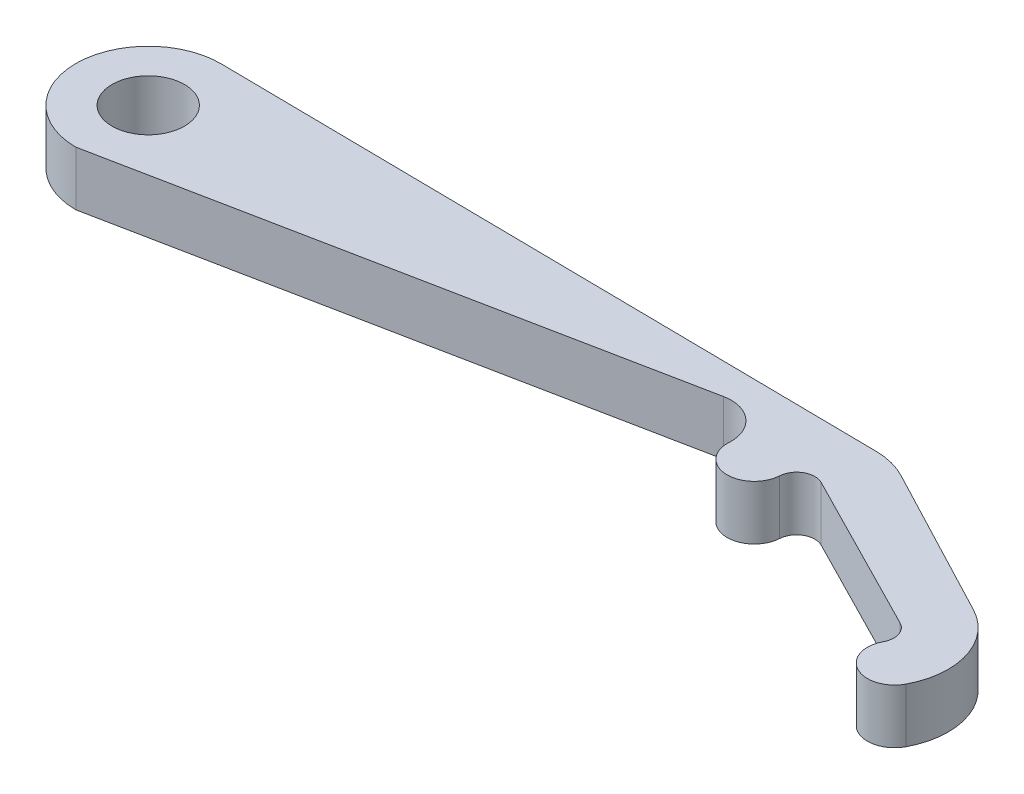
ISO-10303-21;
HEADER;
FILE_DESCRIPTION(('STEP AP214'),'2;1');
FILE_NAME('part.step','',(''),(''),'','','');
FILE_SCHEMA(('AUTOMOTIVE_DESIGN { 1 0 10303 214 1 1 1 1 }'));
ENDSEC;
DATA;
#1=APPLICATION_CONTEXT('core data for automotive mechanical design processes');
#2=APPLICATION_PROTOCOL_DEFINITION('international standard','automotive_design',2000,#1);
#3=PRODUCT_CONTEXT('',#1,'mechanical');
#4=PRODUCT('Part','Part','',(#3));
#5=PRODUCT_RELATED_PRODUCT_CATEGORY('part','',(#4));
#6=PRODUCT_DEFINITION_FORMATION('','',#4);
#7=PRODUCT_DEFINITION_CONTEXT('part definition',#1,'design');
#8=PRODUCT_DEFINITION('design','',#6,#7);
#9=PRODUCT_DEFINITION_SHAPE('','',#8);
#10=(LENGTH_UNIT() NAMED_UNIT(*) SI_UNIT(.MILLI.,.METRE.));
#11=(NAMED_UNIT(*) PLANE_ANGLE_UNIT() SI_UNIT($,.RADIAN.));
#12=(NAMED_UNIT(*) SI_UNIT($,.STERADIAN.) SOLID_ANGLE_UNIT());
#13=UNCERTAINTY_MEASURE_WITH_UNIT(LENGTH_MEASURE(1.E-05),#10,'distance_accuracy_value','');
#14=(GEOMETRIC_REPRESENTATION_CONTEXT(3) GLOBAL_UNCERTAINTY_ASSIGNED_CONTEXT((#13)) GLOBAL_UNIT_ASSIGNED_CONTEXT((#10,
#11,#12)) REPRESENTATION_CONTEXT('',''));
#15=CARTESIAN_POINT('',(0.,0.,0.));
#16=DIRECTION('',(0.,0.,1.));
#17=DIRECTION('',(1.,0.,0.));
#18=AXIS2_PLACEMENT_3D('',#15,#16,#17);
#19=CARTESIAN_POINT('',(6.565,3.,-0.030000000000006));
#20=DIRECTION('',(0.,-1.,0.));
#21=DIRECTION('',(0.,0.,-1.));
#22=AXIS2_PLACEMENT_3D('',#19,#20,#21);
#23=CYLINDRICAL_SURFACE('',#22,1.96698716467194);
#24=CARTESIAN_POINT('',(6.565,0.,-0.030000000000006));
#25=DIRECTION('',(0.,1.,0.));
#26=DIRECTION('',(0.,0.,1.));
#27=AXIS2_PLACEMENT_3D('',#24,#25,#26);
#28=CIRCLE('',#27,1.96698716467194);
#29=CARTESIAN_POINT('',(8.52802301292451,0.,0.0948164921512668));
#30=VERTEX_POINT('',#29);
#31=CARTESIAN_POINT('',(6.17961886330026,0.,-1.95886492151737));
#32=VERTEX_POINT('',#31);
#33=EDGE_CURVE('E174',#30,#32,#28,.T.);
#34=ORIENTED_EDGE('',*,*,#33,.F.);
#35=DIRECTION('',(0.,-1.,0.));
#36=VECTOR('',#35,1.);
#37=CARTESIAN_POINT('',(8.52802301292451,3.,0.0948164921512668));
#38=LINE('',#37,#36);
#39=CARTESIAN_POINT('',(8.52802301292451,3.,0.0948164921512668));
#40=VERTEX_POINT('',#39);
#41=EDGE_CURVE('E11',#40,#30,#38,.T.);
#42=ORIENTED_EDGE('',*,*,#41,.F.);
#43=CARTESIAN_POINT('',(6.565,3.,-0.030000000000006));
#44=DIRECTION('',(0.,1.,0.));
#45=DIRECTION('',(0.,0.,1.));
#46=AXIS2_PLACEMENT_3D('',#43,#44,#45);
#47=CIRCLE('',#46,1.96698716467194);
#48=CARTESIAN_POINT('',(6.17961886330026,3.,-1.95886492151737));
#49=VERTEX_POINT('',#48);
#50=EDGE_CURVE('E217',#40,#49,#47,.T.);
#51=ORIENTED_EDGE('',*,*,#50,.T.);
#52=DIRECTION('',(0.,-1.,0.));
#53=VECTOR('',#52,1.);
#54=CARTESIAN_POINT('',(6.17961886330026,3.,-1.95886492151737));
#55=LINE('',#54,#53);
#56=EDGE_CURVE('E108',#49,#32,#55,.T.);
#57=ORIENTED_EDGE('',*,*,#56,.T.);
#58=EDGE_LOOP('',(#34,#42,#51,#57));
#59=FACE_BOUND('',#58,.T.);
#60=ADVANCED_FACE('F43',(#59),#23,.F.);
#61=CARTESIAN_POINT('',(10.025,3.,0.19));
#62=DIRECTION('',(0.,-1.,0.));
#63=DIRECTION('',(0.,0.,-1.));
#64=AXIS2_PLACEMENT_3D('',#61,#62,#63);
#65=CYLINDRICAL_SURFACE('',#64,1.5);
#66=CARTESIAN_POINT('',(10.025,0.,0.19));
#67=DIRECTION('',(0.,1.,0.));
#68=DIRECTION('',(0.,0.,1.));
#69=AXIS2_PLACEMENT_3D('',#66,#67,#68);
#70=CIRCLE('',#69,1.5);
#71=CARTESIAN_POINT('',(11.5219374050868,0.,0.285803993925553));
#72=VERTEX_POINT('',#71);
#73=EDGE_CURVE('E178',#30,#72,#70,.T.);
#74=ORIENTED_EDGE('',*,*,#73,.T.);
#75=DIRECTION('',(0.,-1.,0.));
#76=VECTOR('',#75,1.);
#77=CARTESIAN_POINT('',(11.5219374050868,3.,0.285803993925553));
#78=LINE('',#77,#76);
#79=CARTESIAN_POINT('',(11.5219374050868,3.,0.285803993925553));
#80=VERTEX_POINT('',#79);
#81=EDGE_CURVE('E55',#80,#72,#78,.T.);
#82=ORIENTED_EDGE('',*,*,#81,.F.);
#83=CARTESIAN_POINT('',(10.025,3.,0.19));
#84=DIRECTION('',(0.,1.,0.));
#85=DIRECTION('',(0.,0.,1.));
#86=AXIS2_PLACEMENT_3D('',#83,#84,#85);
#87=CIRCLE('',#86,1.5);
#88=EDGE_CURVE('E269',#40,#80,#87,.T.);
#89=ORIENTED_EDGE('',*,*,#88,.F.);
#90=ORIENTED_EDGE('',*,*,#41,.T.);
#91=EDGE_LOOP('',(#74,#82,#89,#90));
#92=FACE_BOUND('',#91,.T.);
#93=ADVANCED_FACE('F258',(#92),#65,.T.);
#94=CARTESIAN_POINT('',(12.525,3.,0.35));
#95=DIRECTION('',(0.,-1.,0.));
#96=DIRECTION('',(0.,0.,-1.));
#97=AXIS2_PLACEMENT_3D('',#94,#95,#96);
#98=CYLINDRICAL_SURFACE('',#97,1.00511476783001);
#99=CARTESIAN_POINT('',(12.525,0.,0.35));
#100=DIRECTION('',(0.,1.,0.));
#101=DIRECTION('',(0.,0.,1.));
#102=AXIS2_PLACEMENT_3D('',#99,#100,#101);
#103=CIRCLE('',#102,1.00511476783001);
#104=CARTESIAN_POINT('',(12.9817270735408,0.,-0.545352487462236));
#105=VERTEX_POINT('',#104);
#106=EDGE_CURVE('E185',#105,#72,#103,.T.);
#107=ORIENTED_EDGE('',*,*,#106,.F.);
#108=DIRECTION('',(0.,-1.,0.));
#109=VECTOR('',#108,1.);
#110=CARTESIAN_POINT('',(12.9817270735408,3.,-0.545352487462236));
#111=LINE('',#110,#109);
#112=CARTESIAN_POINT('',(12.9817270735408,3.,-0.545352487462236));
#113=VERTEX_POINT('',#112);
#114=EDGE_CURVE('E241',#113,#105,#111,.T.);
#115=ORIENTED_EDGE('',*,*,#114,.F.);
#116=CARTESIAN_POINT('',(12.525,3.,0.35));
#117=DIRECTION('',(0.,1.,0.));
#118=DIRECTION('',(0.,0.,1.));
#119=AXIS2_PLACEMENT_3D('',#116,#117,#118);
#120=CIRCLE('',#119,1.00511476783001);
#121=EDGE_CURVE('E255',#113,#80,#120,.T.);
#122=ORIENTED_EDGE('',*,*,#121,.T.);
#123=ORIENTED_EDGE('',*,*,#81,.T.);
#124=EDGE_LOOP('',(#107,#115,#122,#123));
#125=FACE_BOUND('',#124,.T.);
#126=ADVANCED_FACE('F252',(#125),#98,.F.);
#127=CARTESIAN_POINT('',(2.90124101476722,3.,-5.68749590244538));
#128=DIRECTION('',(-0.454402908164279,0.,0.890796271350439));
#129=DIRECTION('',(0.890796271350439,0.,0.454402908164279));
#130=AXIS2_PLACEMENT_3D('',#127,#128,#129);
#131=PLANE('',#130);
#132=DIRECTION('',(-0.890796271350439,0.,-0.454402908164279));
#133=VECTOR('',#132,1.);
#134=CARTESIAN_POINT('',(2.90124101476722,0.,-5.68749590244538));
#135=LINE('',#134,#133);
#136=CARTESIAN_POINT('',(21.8896755172,0.,3.99866931500869));
#137=VERTEX_POINT('',#136);
#138=EDGE_CURVE('E186',#137,#105,#135,.T.);
#139=ORIENTED_EDGE('',*,*,#138,.F.);
#140=DIRECTION('',(0.,-1.,0.));
#141=VECTOR('',#140,1.);
#142=CARTESIAN_POINT('',(21.8896755172,3.,3.99866931500869));
#143=LINE('',#142,#141);
#144=CARTESIAN_POINT('',(21.8896755172,3.,3.99866931500869));
#145=VERTEX_POINT('',#144);
#146=EDGE_CURVE('E238',#145,#137,#143,.T.);
#147=ORIENTED_EDGE('',*,*,#146,.F.);
#148=DIRECTION('',(-0.890796271350439,0.,-0.454402908164279));
#149=VECTOR('',#148,1.);
#150=CARTESIAN_POINT('',(2.90124101476722,3.,-5.68749590244538));
#151=LINE('',#150,#149);
#152=EDGE_CURVE('E270',#145,#113,#151,.T.);
#153=ORIENTED_EDGE('',*,*,#152,.T.);
#154=ORIENTED_EDGE('',*,*,#114,.T.);
#155=EDGE_LOOP('',(#139,#147,#153,#154));
#156=FACE_BOUND('',#155,.T.);
#157=ADVANCED_FACE('F264',(#156),#131,.T.);
#158=CARTESIAN_POINT('',(21.435,3.,4.89));
#159=DIRECTION('',(0.,-1.,0.));
#160=DIRECTION('',(0.,0.,-1.));
#161=AXIS2_PLACEMENT_3D('',#158,#159,#160);
#162=CYLINDRICAL_SURFACE('',#161,1.00059992801728);
#163=CARTESIAN_POINT('',(21.435,0.,4.89));
#164=DIRECTION('',(0.,1.,0.));
#165=DIRECTION('',(0.,0.,1.));
#166=AXIS2_PLACEMENT_3D('',#163,#164,#165);
#167=CIRCLE('',#166,1.00059992801728);
#168=CARTESIAN_POINT('',(22.3193181254794,0.,5.35816841937145));
#169=VERTEX_POINT('',#168);
#170=EDGE_CURVE('E189',#169,#137,#167,.T.);
#171=ORIENTED_EDGE('',*,*,#170,.F.);
#172=DIRECTION('',(0.,-1.,0.));
#173=VECTOR('',#172,1.);
#174=CARTESIAN_POINT('',(22.3193181254794,3.,5.35816841937145));
#175=LINE('',#174,#173);
#176=CARTESIAN_POINT('',(22.3193181254794,3.,5.35816841937145));
#177=VERTEX_POINT('',#176);
#178=EDGE_CURVE('E240',#177,#169,#175,.T.);
#179=ORIENTED_EDGE('',*,*,#178,.F.);
#180=CARTESIAN_POINT('',(21.435,3.,4.89));
#181=DIRECTION('',(0.,1.,0.));
#182=DIRECTION('',(0.,0.,1.));
#183=AXIS2_PLACEMENT_3D('',#180,#181,#182);
#184=CIRCLE('',#183,1.00059992801728);
#185=EDGE_CURVE('E276',#177,#145,#184,.T.);
#186=ORIENTED_EDGE('',*,*,#185,.T.);
#187=ORIENTED_EDGE('',*,*,#146,.T.);
#188=EDGE_LOOP('',(#171,#179,#186,#187));
#189=FACE_BOUND('',#188,.T.);
#190=ADVANCED_FACE('F326',(#189),#162,.F.);
#191=CARTESIAN_POINT('',(23.645,3.,6.06));
#192=DIRECTION('',(0.,-1.,0.));
#193=DIRECTION('',(0.,0.,-1.));
#194=AXIS2_PLACEMENT_3D('',#191,#192,#193);
#195=CYLINDRICAL_SURFACE('',#194,1.5);
#196=CARTESIAN_POINT('',(23.645,0.,6.06));
#197=DIRECTION('',(0.,1.,0.));
#198=DIRECTION('',(0.,0.,1.));
#199=AXIS2_PLACEMENT_3D('',#196,#197,#198);
#200=CIRCLE('',#199,1.5);
#201=CARTESIAN_POINT('',(24.9706818745206,0.,6.76183158062855));
#202=VERTEX_POINT('',#201);
#203=EDGE_CURVE('E191',#169,#202,#200,.T.);
#204=ORIENTED_EDGE('',*,*,#203,.T.);
#205=DIRECTION('',(0.,-1.,0.));
#206=VECTOR('',#205,1.);
#207=CARTESIAN_POINT('',(24.9706818745206,3.,6.76183158062855));
#208=LINE('',#207,#206);
#209=CARTESIAN_POINT('',(24.9706818745206,3.,6.76183158062855));
#210=VERTEX_POINT('',#209);
#211=EDGE_CURVE('E232',#210,#202,#208,.T.);
#212=ORIENTED_EDGE('',*,*,#211,.F.);
#213=CARTESIAN_POINT('',(23.645,3.,6.06));
#214=DIRECTION('',(0.,1.,0.));
#215=DIRECTION('',(0.,0.,1.));
#216=AXIS2_PLACEMENT_3D('',#213,#214,#215);
#217=CIRCLE('',#216,1.5);
#218=EDGE_CURVE('E284',#177,#210,#217,.T.);
#219=ORIENTED_EDGE('',*,*,#218,.F.);
#220=ORIENTED_EDGE('',*,*,#178,.T.);
#221=EDGE_LOOP('',(#204,#212,#219,#220));
#222=FACE_BOUND('',#221,.T.);
#223=ADVANCED_FACE('F335',(#222),#195,.T.);
#224=CARTESIAN_POINT('',(21.435,3.,4.89));
#225=DIRECTION('',(0.,-1.,0.));
#226=DIRECTION('',(0.,0.,-1.));
#227=AXIS2_PLACEMENT_3D('',#224,#225,#226);
#228=CYLINDRICAL_SURFACE('',#227,4.00059992801727);
#229=CARTESIAN_POINT('',(21.435,0.,4.89));
#230=DIRECTION('',(0.,1.,0.));
#231=DIRECTION('',(0.,0.,1.));
#232=AXIS2_PLACEMENT_3D('',#229,#230,#231);
#233=CIRCLE('',#232,4.00059992801727);
#234=CARTESIAN_POINT('',(23.2944822203747,0.,1.34780778949504));
#235=VERTEX_POINT('',#234);
#236=EDGE_CURVE('E200',#202,#235,#233,.T.);
#237=ORIENTED_EDGE('',*,*,#236,.T.);
#238=DIRECTION('',(0.,-1.,0.));
#239=VECTOR('',#238,1.);
#240=CARTESIAN_POINT('',(23.2944822203747,3.,1.34780778949504));
#241=LINE('',#240,#239);
#242=CARTESIAN_POINT('',(23.2944822203747,3.,1.34780778949504));
#243=VERTEX_POINT('',#242);
#244=EDGE_CURVE('E229',#243,#235,#241,.T.);
#245=ORIENTED_EDGE('',*,*,#244,.F.);
#246=CARTESIAN_POINT('',(21.435,3.,4.89));
#247=DIRECTION('',(0.,1.,0.));
#248=DIRECTION('',(0.,0.,1.));
#249=AXIS2_PLACEMENT_3D('',#246,#247,#248);
#250=CIRCLE('',#249,4.00059992801727);
#251=EDGE_CURVE('E288',#210,#243,#250,.T.);
#252=ORIENTED_EDGE('',*,*,#251,.F.);
#253=ORIENTED_EDGE('',*,*,#211,.T.);
#254=EDGE_LOOP('',(#237,#245,#252,#253));
#255=FACE_BOUND('',#254,.T.);
#256=ADVANCED_FACE('F337',(#255),#228,.T.);
#257=CARTESIAN_POINT('',(4.47785665128649,3.,-8.53002452841317));
#258=DIRECTION('',(0.464800843331596,0.,-0.88541525627145));
#259=DIRECTION('',(-0.88541525627145,0.,-0.464800843331596));
#260=AXIS2_PLACEMENT_3D('',#257,#258,#259);
#261=PLANE('',#260);
#262=DIRECTION('',(0.88541525627145,0.,0.464800843331596));
#263=VECTOR('',#262,1.);
#264=CARTESIAN_POINT('',(4.47785665128649,0.,-8.53002452841317));
#265=LINE('',#264,#263);
#266=CARTESIAN_POINT('',(14.8342033733264,0.,-3.09343570057983));
#267=VERTEX_POINT('',#266);
#268=EDGE_CURVE('E202',#267,#235,#265,.T.);
#269=ORIENTED_EDGE('',*,*,#268,.F.);
#270=DIRECTION('',(0.,-1.,0.));
#271=VECTOR('',#270,1.);
#272=CARTESIAN_POINT('',(14.8342033733264,3.,-3.09343570057983));
#273=LINE('',#272,#271);
#274=CARTESIAN_POINT('',(14.8342033733264,3.,-3.09343570057983));
#275=VERTEX_POINT('',#274);
#276=EDGE_CURVE('E230',#275,#267,#273,.T.);
#277=ORIENTED_EDGE('',*,*,#276,.F.);
#278=DIRECTION('',(0.88541525627145,0.,0.464800843331596));
#279=VECTOR('',#278,1.);
#280=CARTESIAN_POINT('',(4.47785665128649,3.,-8.53002452841317));
#281=LINE('',#280,#279);
#282=EDGE_CURVE('E161',#275,#243,#281,.T.);
#283=ORIENTED_EDGE('',*,*,#282,.T.);
#284=ORIENTED_EDGE('',*,*,#244,.T.);
#285=EDGE_LOOP('',(#269,#277,#283,#284));
#286=FACE_BOUND('',#285,.T.);
#287=ADVANCED_FACE('F291',(#286),#261,.T.);
#288=CARTESIAN_POINT('',(12.975,3.,0.44822532450597));
#289=DIRECTION('',(0.,-1.,0.));
#290=DIRECTION('',(0.,0.,-1.));
#291=AXIS2_PLACEMENT_3D('',#288,#289,#290);
#292=CYLINDRICAL_SURFACE('',#291,4.);
#293=CARTESIAN_POINT('',(12.975,0.,0.44822532450597));
#294=DIRECTION('',(0.,1.,0.));
#295=DIRECTION('',(0.,0.,1.));
#296=AXIS2_PLACEMENT_3D('',#293,#294,#295);
#297=CIRCLE('',#296,4.);
#298=CARTESIAN_POINT('',(13.0239559533345,0.,-3.55147507860338));
#299=VERTEX_POINT('',#298);
#300=EDGE_CURVE('E203',#299,#267,#297,.F.);
#301=ORIENTED_EDGE('',*,*,#300,.F.);
#302=DIRECTION('',(0.,-1.,0.));
#303=VECTOR('',#302,1.);
#304=CARTESIAN_POINT('',(13.0239559533345,3.,-3.55147507860338));
#305=LINE('',#304,#303);
#306=CARTESIAN_POINT('',(13.0239559533345,3.,-3.55147507860338));
#307=VERTEX_POINT('',#306);
#308=EDGE_CURVE('E150',#307,#299,#305,.T.);
#309=ORIENTED_EDGE('',*,*,#308,.F.);
#310=CARTESIAN_POINT('',(12.975,3.,0.44822532450597));
#311=DIRECTION('',(0.,1.,0.));
#312=DIRECTION('',(0.,0.,1.));
#313=AXIS2_PLACEMENT_3D('',#310,#311,#312);
#314=CIRCLE('',#313,4.);
#315=EDGE_CURVE('E159',#307,#275,#314,.F.);
#316=ORIENTED_EDGE('',*,*,#315,.T.);
#317=ORIENTED_EDGE('',*,*,#276,.T.);
#318=EDGE_LOOP('',(#301,#309,#316,#317));
#319=FACE_BOUND('',#318,.T.);
#320=ADVANCED_FACE('F300',(#319),#292,.T.);
#321=CARTESIAN_POINT('',(0.0454141017407658,3.,-3.71033119911253));
#322=DIRECTION('',(0.0122389883336316,0.,-0.999925100777338));
#323=DIRECTION('',(-0.999925100777338,0.,-0.0122389883336316));
#324=AXIS2_PLACEMENT_3D('',#321,#322,#323);
#325=PLANE('',#324);
#326=DIRECTION('',(0.999925100777338,0.,0.0122389883336316));
#327=VECTOR('',#326,1.);
#328=CARTESIAN_POINT('',(0.0454141017407658,0.,-3.71033119911253));
#329=LINE('',#328,#327);
#330=CARTESIAN_POINT('',(-23.5960440466655,0.,-3.99970040310935));
#331=VERTEX_POINT('',#330);
#332=EDGE_CURVE('E144',#331,#299,#329,.T.);
#333=ORIENTED_EDGE('',*,*,#332,.F.);
#334=DIRECTION('',(0.,-1.,0.));
#335=VECTOR('',#334,1.);
#336=CARTESIAN_POINT('',(-23.5960440466655,3.,-3.99970040310935));
#337=LINE('',#336,#335);
#338=CARTESIAN_POINT('',(-23.5960440466655,3.,-3.99970040310935));
#339=VERTEX_POINT('',#338);
#340=EDGE_CURVE('E137',#339,#331,#337,.T.);
#341=ORIENTED_EDGE('',*,*,#340,.F.);
#342=DIRECTION('',(0.999925100777338,0.,0.0122389883336316));
#343=VECTOR('',#342,1.);
#344=CARTESIAN_POINT('',(0.0454141017407658,3.,-3.71033119911253));
#345=LINE('',#344,#343);
#346=EDGE_CURVE('E142',#339,#307,#345,.T.);
#347=ORIENTED_EDGE('',*,*,#346,.T.);
#348=ORIENTED_EDGE('',*,*,#308,.T.);
#349=EDGE_LOOP('',(#333,#341,#347,#348));
#350=FACE_BOUND('',#349,.T.);
#351=ADVANCED_FACE('F141',(#350),#325,.T.);
#352=CARTESIAN_POINT('',(-23.645,3.,0.));
#353=DIRECTION('',(0.,-1.,0.));
#354=DIRECTION('',(0.,0.,-1.));
#355=AXIS2_PLACEMENT_3D('',#352,#353,#354);
#356=CYLINDRICAL_SURFACE('',#355,3.99999999999999);
#357=CARTESIAN_POINT('',(-23.645,0.,0.));
#358=DIRECTION('',(0.,1.,0.));
#359=DIRECTION('',(0.,0.,1.));
#360=AXIS2_PLACEMENT_3D('',#357,#358,#359);
#361=CIRCLE('',#360,3.99999999999999);
#362=CARTESIAN_POINT('',(-23.645,0.,3.99999999999999));
#363=VERTEX_POINT('',#362);
#364=EDGE_CURVE('E98',#331,#363,#361,.T.);
#365=ORIENTED_EDGE('',*,*,#364,.T.);
#366=DIRECTION('',(0.,-1.,0.));
#367=VECTOR('',#366,1.);
#368=CARTESIAN_POINT('',(-23.645,3.,3.99999999999999));
#369=LINE('',#368,#367);
#370=CARTESIAN_POINT('',(-23.645,3.,3.99999999999999));
#371=VERTEX_POINT('',#370);
#372=EDGE_CURVE('E149',#371,#363,#369,.T.);
#373=ORIENTED_EDGE('',*,*,#372,.F.);
#374=CARTESIAN_POINT('',(-23.645,3.,0.));
#375=DIRECTION('',(0.,1.,0.));
#376=DIRECTION('',(0.,0.,1.));
#377=AXIS2_PLACEMENT_3D('',#374,#375,#376);
#378=CIRCLE('',#377,3.99999999999999);
#379=EDGE_CURVE('E148',#339,#371,#378,.T.);
#380=ORIENTED_EDGE('',*,*,#379,.F.);
#381=ORIENTED_EDGE('',*,*,#340,.T.);
#382=EDGE_LOOP('',(#365,#373,#380,#381));
#383=FACE_BOUND('',#382,.T.);
#384=ADVANCED_FACE('F153',(#383),#356,.T.);
#385=CARTESIAN_POINT('',(-0.139137968639626,3.,-0.696397206304518));
#386=DIRECTION('',(-0.195924581319784,0.,-0.980618966997206));
#387=DIRECTION('',(-0.980618966997206,0.,0.195924581319784));
#388=AXIS2_PLACEMENT_3D('',#385,#386,#387);
#389=PLANE('',#388);
#390=DIRECTION('',(0.980618966997206,0.,-0.195924581319784));
#391=VECTOR('',#390,1.);
#392=CARTESIAN_POINT('',(-0.139137968639626,0.,-0.696397206304518));
#393=LINE('',#392,#391);
#394=EDGE_CURVE('E211',#363,#32,#393,.T.);
#395=ORIENTED_EDGE('',*,*,#394,.T.);
#396=ORIENTED_EDGE('',*,*,#56,.F.);
#397=DIRECTION('',(0.980618966997206,0.,-0.195924581319784));
#398=VECTOR('',#397,1.);
#399=CARTESIAN_POINT('',(-0.139137968639626,3.,-0.696397206304518));
#400=LINE('',#399,#398);
#401=EDGE_CURVE('E58',#371,#49,#400,.T.);
#402=ORIENTED_EDGE('',*,*,#401,.F.);
#403=ORIENTED_EDGE('',*,*,#372,.T.);
#404=EDGE_LOOP('',(#395,#396,#402,#403));
#405=FACE_BOUND('',#404,.T.);
#406=ADVANCED_FACE('F303',(#405),#389,.F.);
#407=CARTESIAN_POINT('',(-23.645,3.,0.));
#408=DIRECTION('',(0.,-1.,0.));
#409=DIRECTION('',(0.,0.,-1.));
#410=AXIS2_PLACEMENT_3D('',#407,#408,#409);
#411=CYLINDRICAL_SURFACE('',#410,2.);
#412=CARTESIAN_POINT('',(-23.645,3.,0.));
#413=DIRECTION('',(0.,1.,0.));
#414=DIRECTION('',(0.,0.,1.));
#415=AXIS2_PLACEMENT_3D('',#412,#413,#414);
#416=CIRCLE('',#415,2.);
#417=CARTESIAN_POINT('',(-23.645,3.,2.));
#418=VERTEX_POINT('',#417);
#419=EDGE_CURVE('E169',#418,#418,#416,.T.);
#420=ORIENTED_EDGE('',*,*,#419,.T.);
#421=EDGE_LOOP('',(#420));
#422=FACE_BOUND('',#421,.T.);
#423=CARTESIAN_POINT('',(-23.645,0.,0.));
#424=DIRECTION('',(0.,1.,0.));
#425=DIRECTION('',(0.,0.,1.));
#426=AXIS2_PLACEMENT_3D('',#423,#424,#425);
#427=CIRCLE('',#426,2.);
#428=CARTESIAN_POINT('',(-23.645,0.,2.));
#429=VERTEX_POINT('',#428);
#430=EDGE_CURVE('E218',#429,#429,#427,.T.);
#431=ORIENTED_EDGE('',*,*,#430,.F.);
#432=EDGE_LOOP('',(#431));
#433=FACE_BOUND('',#432,.T.);
#434=ADVANCED_FACE('F353',(#422,#433),#411,.F.);
#435=CARTESIAN_POINT('',(0.,3.,0.));
#436=DIRECTION('',(0.,1.,0.));
#437=DIRECTION('',(0.,0.,1.));
#438=AXIS2_PLACEMENT_3D('',#435,#436,#437);
#439=PLANE('',#438);
#440=ORIENTED_EDGE('',*,*,#50,.F.);
#441=ORIENTED_EDGE('',*,*,#88,.T.);
#442=ORIENTED_EDGE('',*,*,#121,.F.);
#443=ORIENTED_EDGE('',*,*,#152,.F.);
#444=ORIENTED_EDGE('',*,*,#185,.F.);
#445=ORIENTED_EDGE('',*,*,#218,.T.);
#446=ORIENTED_EDGE('',*,*,#251,.T.);
#447=ORIENTED_EDGE('',*,*,#282,.F.);
#448=ORIENTED_EDGE('',*,*,#315,.F.);
#449=ORIENTED_EDGE('',*,*,#346,.F.);
#450=ORIENTED_EDGE('',*,*,#379,.T.);
#451=ORIENTED_EDGE('',*,*,#401,.T.);
#452=EDGE_LOOP('',(#440,#441,#442,#443,#444,#445,#446,#447,#448,#449,#450,#451));
#453=FACE_BOUND('',#452,.T.);
#454=ORIENTED_EDGE('',*,*,#419,.F.);
#455=EDGE_LOOP('',(#454));
#456=FACE_BOUND('',#455,.T.);
#457=ADVANCED_FACE('F154',(#453,#456),#439,.T.);
#458=CARTESIAN_POINT('',(0.,0.,0.));
#459=DIRECTION('',(0.,1.,0.));
#460=DIRECTION('',(0.,0.,1.));
#461=AXIS2_PLACEMENT_3D('',#458,#459,#460);
#462=PLANE('',#461);
#463=ORIENTED_EDGE('',*,*,#33,.T.);
#464=ORIENTED_EDGE('',*,*,#394,.F.);
#465=ORIENTED_EDGE('',*,*,#364,.F.);
#466=ORIENTED_EDGE('',*,*,#332,.T.);
#467=ORIENTED_EDGE('',*,*,#300,.T.);
#468=ORIENTED_EDGE('',*,*,#268,.T.);
#469=ORIENTED_EDGE('',*,*,#236,.F.);
#470=ORIENTED_EDGE('',*,*,#203,.F.);
#471=ORIENTED_EDGE('',*,*,#170,.T.);
#472=ORIENTED_EDGE('',*,*,#138,.T.);
#473=ORIENTED_EDGE('',*,*,#106,.T.);
#474=ORIENTED_EDGE('',*,*,#73,.F.);
#475=EDGE_LOOP('',(#463,#464,#465,#466,#467,#468,#469,#470,#471,#472,#473,#474));
#476=FACE_BOUND('',#475,.T.);
#477=ORIENTED_EDGE('',*,*,#430,.T.);
#478=EDGE_LOOP('',(#477));
#479=FACE_BOUND('',#478,.T.);
#480=ADVANCED_FACE('F256',(#476,#479),#462,.F.);
#481=CLOSED_SHELL('',(#60,#93,#126,#157,#190,#223,#256,#287,#320,#351,#384,#406,#434,#457,#480));
#482=MANIFOLD_SOLID_BREP('B2',#481);
#483=ADVANCED_BREP_SHAPE_REPRESENTATION('',(#18,#482),#14);
#484=SHAPE_DEFINITION_REPRESENTATION(#9,#483);
ENDSEC;
END-ISO-10303-21;
